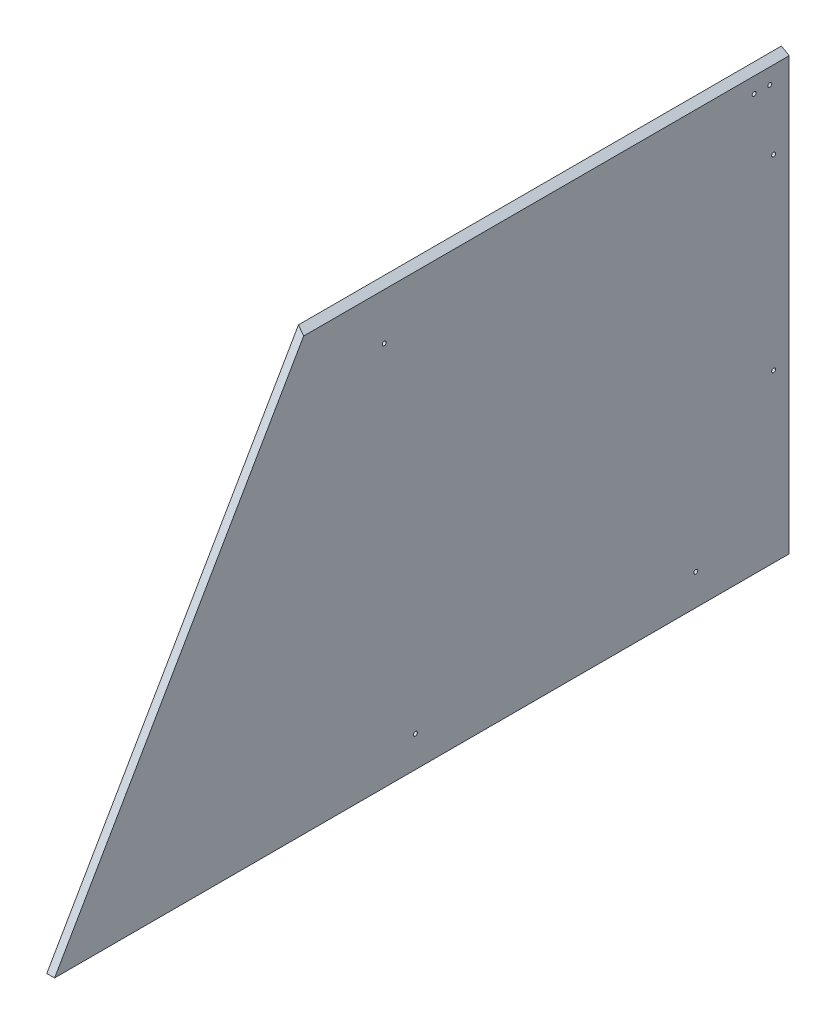
ISO-10303-21;
HEADER;
FILE_DESCRIPTION(('STEP AP214'),'2;1');
FILE_NAME('part.step','',(''),(''),'','','');
FILE_SCHEMA(('AUTOMOTIVE_DESIGN { 1 0 10303 214 1 1 1 1 }'));
ENDSEC;
DATA;
#1=APPLICATION_CONTEXT('core data for automotive mechanical design processes');
#2=APPLICATION_PROTOCOL_DEFINITION('international standard','automotive_design',2000,#1);
#3=PRODUCT_CONTEXT('',#1,'mechanical');
#4=PRODUCT('Part','Part','',(#3));
#5=PRODUCT_RELATED_PRODUCT_CATEGORY('part','',(#4));
#6=PRODUCT_DEFINITION_FORMATION('','',#4);
#7=PRODUCT_DEFINITION_CONTEXT('part definition',#1,'design');
#8=PRODUCT_DEFINITION('design','',#6,#7);
#9=PRODUCT_DEFINITION_SHAPE('','',#8);
#10=(LENGTH_UNIT() NAMED_UNIT(*) SI_UNIT(.MILLI.,.METRE.));
#11=(NAMED_UNIT(*) PLANE_ANGLE_UNIT() SI_UNIT($,.RADIAN.));
#12=(NAMED_UNIT(*) SI_UNIT($,.STERADIAN.) SOLID_ANGLE_UNIT());
#13=UNCERTAINTY_MEASURE_WITH_UNIT(LENGTH_MEASURE(1.E-05),#10,'distance_accuracy_value','');
#14=(GEOMETRIC_REPRESENTATION_CONTEXT(3) GLOBAL_UNCERTAINTY_ASSIGNED_CONTEXT((#13)) GLOBAL_UNIT_ASSIGNED_CONTEXT((#10,
#11,#12)) REPRESENTATION_CONTEXT('',''));
#15=CARTESIAN_POINT('',(0.,0.,0.));
#16=DIRECTION('',(0.,0.,1.));
#17=DIRECTION('',(1.,0.,0.));
#18=AXIS2_PLACEMENT_3D('',#15,#16,#17);
#19=CARTESIAN_POINT('',(6.35,105.408802096826,-559.540640379776));
#20=DIRECTION('',(0.,0.,1.));
#21=DIRECTION('',(0.,-1.,0.));
#22=AXIS2_PLACEMENT_3D('',#19,#20,#21);
#23=PLANE('',#22);
#24=DIRECTION('',(0.,1.,0.));
#25=VECTOR('',#24,1.);
#26=CARTESIAN_POINT('',(0.,105.408802096826,-559.540640379776));
#27=LINE('',#26,#25);
#28=CARTESIAN_POINT('',(0.,-250.191197903174,-559.540640379775));
#29=VERTEX_POINT('',#28);
#30=CARTESIAN_POINT('',(0.,105.232825734777,-559.540640379776));
#31=VERTEX_POINT('',#30);
#32=EDGE_CURVE('E110',#29,#31,#27,.T.);
#33=ORIENTED_EDGE('',*,*,#32,.T.);
#34=DIRECTION('',(0.866025403784436,-0.500000000000005,0.));
#35=VECTOR('',#34,1.);
#36=CARTESIAN_POINT('',(6.35000000000015,101.566651525422,-559.540640379776));
#37=LINE('',#36,#35);
#38=CARTESIAN_POINT('',(6.35,101.566651525422,-559.540640379776));
#39=VERTEX_POINT('',#38);
#40=EDGE_CURVE('E11',#31,#39,#37,.T.);
#41=ORIENTED_EDGE('',*,*,#40,.T.);
#42=DIRECTION('',(0.,1.,0.));
#43=VECTOR('',#42,1.);
#44=CARTESIAN_POINT('',(6.35,105.408802096826,-559.540640379776));
#45=LINE('',#44,#43);
#46=CARTESIAN_POINT('',(6.35,-250.191197903174,-559.540640379775));
#47=VERTEX_POINT('',#46);
#48=EDGE_CURVE('E93',#47,#39,#45,.T.);
#49=ORIENTED_EDGE('',*,*,#48,.F.);
#50=DIRECTION('',(-1.,0.,0.));
#51=VECTOR('',#50,1.);
#52=CARTESIAN_POINT('',(6.35,-250.191197903174,-559.540640379775));
#53=LINE('',#52,#51);
#54=EDGE_CURVE('E101',#47,#29,#53,.T.);
#55=ORIENTED_EDGE('',*,*,#54,.T.);
#56=EDGE_LOOP('',(#33,#41,#49,#55));
#57=FACE_BOUND('',#56,.T.);
#58=ADVANCED_FACE('F43',(#57),#23,.F.);
#59=CARTESIAN_POINT('',(6.35,-250.191197903174,39.465115344054));
#60=DIRECTION('',(0.,-0.499999999999998,-0.86602540378444));
#61=DIRECTION('',(0.,0.86602540378444,-0.499999999999998));
#62=AXIS2_PLACEMENT_3D('',#59,#60,#61);
#63=PLANE('',#62);
#64=DIRECTION('',(0.,-0.86602540378444,0.499999999999998));
#65=VECTOR('',#64,1.);
#66=CARTESIAN_POINT('',(6.35,-250.191197903174,39.465115344054));
#67=LINE('',#66,#65);
#68=CARTESIAN_POINT('',(6.35000000000004,101.566651525422,-163.622373713109));
#69=VERTEX_POINT('',#68);
#70=CARTESIAN_POINT('',(6.35,-250.191197903174,39.465115344054));
#71=VERTEX_POINT('',#70);
#72=EDGE_CURVE('E84',#69,#71,#67,.T.);
#73=ORIENTED_EDGE('',*,*,#72,.F.);
#74=DIRECTION('',(-0.832050294337841,0.480384461415266,-0.277350098112616));
#75=VECTOR('',#74,1.);
#76=CARTESIAN_POINT('',(44.1090093184098,79.7664773311047,-151.036037273639));
#77=LINE('',#76,#75);
#78=CARTESIAN_POINT('',(0.,105.232825734777,-165.739040379776));
#79=VERTEX_POINT('',#78);
#80=EDGE_CURVE('E67',#69,#79,#77,.T.);
#81=ORIENTED_EDGE('',*,*,#80,.T.);
#82=DIRECTION('',(0.,-0.86602540378444,0.499999999999998));
#83=VECTOR('',#82,1.);
#84=CARTESIAN_POINT('',(0.,-250.191197903174,39.465115344054));
#85=LINE('',#84,#83);
#86=CARTESIAN_POINT('',(0.,-250.191197903174,39.465115344054));
#87=VERTEX_POINT('',#86);
#88=EDGE_CURVE('E98',#79,#87,#85,.T.);
#89=ORIENTED_EDGE('',*,*,#88,.T.);
#90=DIRECTION('',(-1.,0.,0.));
#91=VECTOR('',#90,1.);
#92=CARTESIAN_POINT('',(6.35,-250.191197903174,39.465115344054));
#93=LINE('',#92,#91);
#94=EDGE_CURVE('E96',#71,#87,#93,.T.);
#95=ORIENTED_EDGE('',*,*,#94,.F.);
#96=EDGE_LOOP('',(#73,#81,#89,#95));
#97=FACE_BOUND('',#96,.T.);
#98=ADVANCED_FACE('F97',(#97),#63,.F.);
#99=CARTESIAN_POINT('',(6.35,-250.191197903174,39.465115344054));
#100=DIRECTION('',(0.,1.,0.));
#101=DIRECTION('',(0.,0.,1.));
#102=AXIS2_PLACEMENT_3D('',#99,#100,#101);
#103=PLANE('',#102);
#104=DIRECTION('',(0.,0.,-1.));
#105=VECTOR('',#104,1.);
#106=CARTESIAN_POINT('',(0.,-250.191197903174,39.465115344054));
#107=LINE('',#106,#105);
#108=EDGE_CURVE('E116',#87,#29,#107,.T.);
#109=ORIENTED_EDGE('',*,*,#108,.T.);
#110=ORIENTED_EDGE('',*,*,#54,.F.);
#111=DIRECTION('',(0.,0.,-1.));
#112=VECTOR('',#111,1.);
#113=CARTESIAN_POINT('',(6.35,-250.191197903174,39.465115344054));
#114=LINE('',#113,#112);
#115=EDGE_CURVE('E89',#71,#47,#114,.T.);
#116=ORIENTED_EDGE('',*,*,#115,.F.);
#117=ORIENTED_EDGE('',*,*,#94,.T.);
#118=EDGE_LOOP('',(#109,#110,#116,#117));
#119=FACE_BOUND('',#118,.T.);
#120=ADVANCED_FACE('F103',(#119),#103,.F.);
#121=CARTESIAN_POINT('',(6.35,0.,0.));
#122=DIRECTION('',(1.,0.,0.));
#123=DIRECTION('',(0.,0.,-1.));
#124=AXIS2_PLACEMENT_3D('',#121,#122,#123);
#125=PLANE('',#124);
#126=CARTESIAN_POINT('',(6.34999999999999,-224.791197903174,-483.340640379775));
#127=DIRECTION('',(-1.,0.,0.));
#128=DIRECTION('',(0.,0.,1.));
#129=AXIS2_PLACEMENT_3D('',#126,#127,#128);
#130=CIRCLE('',#129,1.63194999999999);
#131=CARTESIAN_POINT('',(6.34999999999999,-224.791197903174,-481.708690379775));
#132=VERTEX_POINT('',#131);
#133=EDGE_CURVE('E175',#132,#132,#130,.T.);
#134=ORIENTED_EDGE('',*,*,#133,.T.);
#135=EDGE_LOOP('',(#134));
#136=FACE_BOUND('',#135,.T.);
#137=CARTESIAN_POINT('',(6.34999999999999,-224.791197903174,-254.740640379775));
#138=DIRECTION('',(-1.,0.,0.));
#139=DIRECTION('',(0.,0.,1.));
#140=AXIS2_PLACEMENT_3D('',#137,#138,#139);
#141=CIRCLE('',#140,1.63194999999999);
#142=CARTESIAN_POINT('',(6.34999999999999,-224.791197903174,-253.108690379775));
#143=VERTEX_POINT('',#142);
#144=EDGE_CURVE('E166',#143,#143,#141,.T.);
#145=ORIENTED_EDGE('',*,*,#144,.T.);
#146=EDGE_LOOP('',(#145));
#147=FACE_BOUND('',#146,.T.);
#148=CARTESIAN_POINT('',(6.34999999999999,88.8666515254223,-543.665640379775));
#149=DIRECTION('',(-1.,0.,0.));
#150=DIRECTION('',(0.,0.,1.));
#151=AXIS2_PLACEMENT_3D('',#148,#149,#150);
#152=CIRCLE('',#151,1.63194999999999);
#153=CARTESIAN_POINT('',(6.34999999999999,88.8666515254223,-542.033690379775));
#154=VERTEX_POINT('',#153);
#155=EDGE_CURVE('E157',#154,#154,#152,.T.);
#156=ORIENTED_EDGE('',*,*,#155,.T.);
#157=EDGE_LOOP('',(#156));
#158=FACE_BOUND('',#157,.T.);
#159=CARTESIAN_POINT('',(6.34999999999999,88.8666515254223,-530.965640379775));
#160=DIRECTION('',(-1.,0.,0.));
#161=DIRECTION('',(0.,0.,1.));
#162=AXIS2_PLACEMENT_3D('',#159,#160,#161);
#163=CIRCLE('',#162,1.63194999999999);
#164=CARTESIAN_POINT('',(6.34999999999999,88.8666515254223,-529.333690379775));
#165=VERTEX_POINT('',#164);
#166=EDGE_CURVE('E148',#165,#165,#163,.T.);
#167=ORIENTED_EDGE('',*,*,#166,.T.);
#168=EDGE_LOOP('',(#167));
#169=FACE_BOUND('',#168,.T.);
#170=CARTESIAN_POINT('',(6.35,38.0988020968257,-546.840640379776));
#171=DIRECTION('',(-1.,0.,0.));
#172=DIRECTION('',(0.,0.,1.));
#173=AXIS2_PLACEMENT_3D('',#170,#171,#172);
#174=CIRCLE('',#173,1.63194999999999);
#175=CARTESIAN_POINT('',(6.35,38.0988020968257,-545.208690379776));
#176=VERTEX_POINT('',#175);
#177=EDGE_CURVE('E139',#176,#176,#174,.T.);
#178=ORIENTED_EDGE('',*,*,#177,.T.);
#179=EDGE_LOOP('',(#178));
#180=FACE_BOUND('',#179,.T.);
#181=CARTESIAN_POINT('',(6.35,63.4988020968257,-229.340640379776));
#182=DIRECTION('',(-1.,0.,0.));
#183=DIRECTION('',(0.,0.,1.));
#184=AXIS2_PLACEMENT_3D('',#181,#182,#183);
#185=CIRCLE('',#184,1.63194999999999);
#186=CARTESIAN_POINT('',(6.35,63.4988020968257,-227.708690379776));
#187=VERTEX_POINT('',#186);
#188=EDGE_CURVE('E130',#187,#187,#185,.T.);
#189=ORIENTED_EDGE('',*,*,#188,.T.);
#190=EDGE_LOOP('',(#189));
#191=FACE_BOUND('',#190,.T.);
#192=CARTESIAN_POINT('',(6.35,-114.301197903174,-546.840640379776));
#193=DIRECTION('',(-1.,0.,0.));
#194=DIRECTION('',(0.,0.,1.));
#195=AXIS2_PLACEMENT_3D('',#192,#193,#194);
#196=CIRCLE('',#195,1.63194999999999);
#197=CARTESIAN_POINT('',(6.35,-114.301197903174,-545.208690379775));
#198=VERTEX_POINT('',#197);
#199=EDGE_CURVE('E113',#198,#198,#196,.T.);
#200=ORIENTED_EDGE('',*,*,#199,.T.);
#201=EDGE_LOOP('',(#200));
#202=FACE_BOUND('',#201,.T.);
#203=ORIENTED_EDGE('',*,*,#48,.T.);
#204=DIRECTION('',(0.,0.,1.));
#205=VECTOR('',#204,1.);
#206=CARTESIAN_POINT('',(6.35,101.566651525422,-165.840640379776));
#207=LINE('',#206,#205);
#208=EDGE_CURVE('E92',#39,#69,#207,.T.);
#209=ORIENTED_EDGE('',*,*,#208,.T.);
#210=ORIENTED_EDGE('',*,*,#72,.T.);
#211=ORIENTED_EDGE('',*,*,#115,.T.);
#212=EDGE_LOOP('',(#203,#209,#210,#211));
#213=FACE_BOUND('',#212,.T.);
#214=ADVANCED_FACE('F87',(#136,#147,#158,#169,#180,#191,#202,#213),#125,.T.);
#215=CARTESIAN_POINT('',(0.,0.,0.));
#216=DIRECTION('',(1.,0.,0.));
#217=DIRECTION('',(0.,0.,-1.));
#218=AXIS2_PLACEMENT_3D('',#215,#216,#217);
#219=PLANE('',#218);
#220=CARTESIAN_POINT('',(0.,-224.791197903174,-483.340640379775));
#221=DIRECTION('',(-1.,0.,0.));
#222=DIRECTION('',(0.,0.,1.));
#223=AXIS2_PLACEMENT_3D('',#220,#221,#222);
#224=CIRCLE('',#223,2.85749999999998);
#225=CARTESIAN_POINT('',(0.,-224.791197903174,-480.483140379775));
#226=VERTEX_POINT('',#225);
#227=EDGE_CURVE('E181',#226,#226,#224,.T.);
#228=ORIENTED_EDGE('',*,*,#227,.F.);
#229=EDGE_LOOP('',(#228));
#230=FACE_BOUND('',#229,.T.);
#231=CARTESIAN_POINT('',(0.,-224.791197903174,-254.740640379775));
#232=DIRECTION('',(-1.,0.,0.));
#233=DIRECTION('',(0.,0.,1.));
#234=AXIS2_PLACEMENT_3D('',#231,#232,#233);
#235=CIRCLE('',#234,2.85749999999998);
#236=CARTESIAN_POINT('',(0.,-224.791197903174,-251.883140379775));
#237=VERTEX_POINT('',#236);
#238=EDGE_CURVE('E172',#237,#237,#235,.T.);
#239=ORIENTED_EDGE('',*,*,#238,.F.);
#240=EDGE_LOOP('',(#239));
#241=FACE_BOUND('',#240,.T.);
#242=CARTESIAN_POINT('',(0.,88.8666515254223,-543.665640379775));
#243=DIRECTION('',(-1.,0.,0.));
#244=DIRECTION('',(0.,0.,1.));
#245=AXIS2_PLACEMENT_3D('',#242,#243,#244);
#246=CIRCLE('',#245,2.8575);
#247=CARTESIAN_POINT('',(0.,88.8666515254223,-540.808140379775));
#248=VERTEX_POINT('',#247);
#249=EDGE_CURVE('E163',#248,#248,#246,.T.);
#250=ORIENTED_EDGE('',*,*,#249,.F.);
#251=EDGE_LOOP('',(#250));
#252=FACE_BOUND('',#251,.T.);
#253=CARTESIAN_POINT('',(0.,88.8666515254223,-530.965640379775));
#254=DIRECTION('',(-1.,0.,0.));
#255=DIRECTION('',(0.,0.,1.));
#256=AXIS2_PLACEMENT_3D('',#253,#254,#255);
#257=CIRCLE('',#256,2.8575);
#258=CARTESIAN_POINT('',(0.,88.8666515254223,-528.108140379775));
#259=VERTEX_POINT('',#258);
#260=EDGE_CURVE('E154',#259,#259,#257,.T.);
#261=ORIENTED_EDGE('',*,*,#260,.F.);
#262=EDGE_LOOP('',(#261));
#263=FACE_BOUND('',#262,.T.);
#264=CARTESIAN_POINT('',(0.,38.0988020968257,-546.840640379776));
#265=DIRECTION('',(-1.,0.,0.));
#266=DIRECTION('',(0.,0.,1.));
#267=AXIS2_PLACEMENT_3D('',#264,#265,#266);
#268=CIRCLE('',#267,2.8575);
#269=CARTESIAN_POINT('',(0.,38.0988020968257,-543.983140379776));
#270=VERTEX_POINT('',#269);
#271=EDGE_CURVE('E145',#270,#270,#268,.T.);
#272=ORIENTED_EDGE('',*,*,#271,.F.);
#273=EDGE_LOOP('',(#272));
#274=FACE_BOUND('',#273,.T.);
#275=CARTESIAN_POINT('',(0.,63.4988020968257,-229.340640379776));
#276=DIRECTION('',(-1.,0.,0.));
#277=DIRECTION('',(0.,0.,1.));
#278=AXIS2_PLACEMENT_3D('',#275,#276,#277);
#279=CIRCLE('',#278,2.8575);
#280=CARTESIAN_POINT('',(0.,63.4988020968257,-226.483140379776));
#281=VERTEX_POINT('',#280);
#282=EDGE_CURVE('E136',#281,#281,#279,.T.);
#283=ORIENTED_EDGE('',*,*,#282,.F.);
#284=EDGE_LOOP('',(#283));
#285=FACE_BOUND('',#284,.T.);
#286=CARTESIAN_POINT('',(0.,-114.301197903174,-546.840640379776));
#287=DIRECTION('',(-1.,0.,0.));
#288=DIRECTION('',(0.,0.,1.));
#289=AXIS2_PLACEMENT_3D('',#286,#287,#288);
#290=CIRCLE('',#289,2.8575);
#291=CARTESIAN_POINT('',(0.,-114.301197903174,-543.983140379776));
#292=VERTEX_POINT('',#291);
#293=EDGE_CURVE('E127',#292,#292,#290,.T.);
#294=ORIENTED_EDGE('',*,*,#293,.F.);
#295=EDGE_LOOP('',(#294));
#296=FACE_BOUND('',#295,.T.);
#297=ORIENTED_EDGE('',*,*,#88,.F.);
#298=DIRECTION('',(0.,0.,-1.));
#299=VECTOR('',#298,1.);
#300=CARTESIAN_POINT('',(0.,105.232825734777,0.));
#301=LINE('',#300,#299);
#302=EDGE_CURVE('E52',#79,#31,#301,.T.);
#303=ORIENTED_EDGE('',*,*,#302,.T.);
#304=ORIENTED_EDGE('',*,*,#32,.F.);
#305=ORIENTED_EDGE('',*,*,#108,.F.);
#306=EDGE_LOOP('',(#297,#303,#304,#305));
#307=FACE_BOUND('',#306,.T.);
#308=ADVANCED_FACE('F187',(#230,#241,#252,#263,#274,#285,#296,#307),#219,.F.);
#309=CARTESIAN_POINT('',(6.35,101.566651525422,0.));
#310=DIRECTION('',(0.500000000000005,0.866025403784436,0.));
#311=DIRECTION('',(0.,0.,-1.));
#312=AXIS2_PLACEMENT_3D('',#309,#310,#311);
#313=PLANE('',#312);
#314=ORIENTED_EDGE('',*,*,#40,.F.);
#315=ORIENTED_EDGE('',*,*,#302,.F.);
#316=ORIENTED_EDGE('',*,*,#80,.F.);
#317=ORIENTED_EDGE('',*,*,#208,.F.);
#318=EDGE_LOOP('',(#314,#315,#316,#317));
#319=FACE_BOUND('',#318,.T.);
#320=ADVANCED_FACE('F45',(#319),#313,.T.);
#321=CARTESIAN_POINT('',(0.,-114.301197903174,-546.840640379776));
#322=DIRECTION('',(-1.,0.,0.));
#323=DIRECTION('',(0.,0.,1.));
#324=AXIS2_PLACEMENT_3D('',#321,#322,#323);
#325=CYLINDRICAL_SURFACE('',#324,1.63194999999999);
#326=ORIENTED_EDGE('',*,*,#199,.F.);
#327=EDGE_LOOP('',(#326));
#328=FACE_BOUND('',#327,.T.);
#329=CARTESIAN_POINT('',(1.40983400146971,-114.301197903174,-546.840640379776));
#330=DIRECTION('',(-1.,0.,0.));
#331=DIRECTION('',(0.,0.,1.));
#332=AXIS2_PLACEMENT_3D('',#329,#330,#331);
#333=CIRCLE('',#332,1.63194999999999);
#334=CARTESIAN_POINT('',(1.40983400146971,-114.301197903174,-545.208690379775));
#335=VERTEX_POINT('',#334);
#336=EDGE_CURVE('E124',#335,#335,#333,.T.);
#337=ORIENTED_EDGE('',*,*,#336,.T.);
#338=EDGE_LOOP('',(#337));
#339=FACE_BOUND('',#338,.T.);
#340=ADVANCED_FACE('F216',(#328,#339),#325,.F.);
#341=CARTESIAN_POINT('',(0.,-114.301197903174,-546.840640379776));
#342=DIRECTION('',(-1.,0.,0.));
#343=DIRECTION('',(0.,0.,1.));
#344=AXIS2_PLACEMENT_3D('',#341,#342,#343);
#345=CONICAL_SURFACE('',#344,2.8575,0.715584993317676);
#346=ORIENTED_EDGE('',*,*,#336,.F.);
#347=EDGE_LOOP('',(#346));
#348=FACE_BOUND('',#347,.T.);
#349=ORIENTED_EDGE('',*,*,#293,.T.);
#350=EDGE_LOOP('',(#349));
#351=FACE_BOUND('',#350,.T.);
#352=ADVANCED_FACE('F219',(#348,#351),#345,.F.);
#353=CARTESIAN_POINT('',(0.,63.4988020968257,-229.340640379776));
#354=DIRECTION('',(-1.,0.,0.));
#355=DIRECTION('',(0.,0.,1.));
#356=AXIS2_PLACEMENT_3D('',#353,#354,#355);
#357=CYLINDRICAL_SURFACE('',#356,1.63194999999999);
#358=ORIENTED_EDGE('',*,*,#188,.F.);
#359=EDGE_LOOP('',(#358));
#360=FACE_BOUND('',#359,.T.);
#361=CARTESIAN_POINT('',(1.40983400146971,63.4988020968257,-229.340640379776));
#362=DIRECTION('',(-1.,0.,0.));
#363=DIRECTION('',(0.,0.,1.));
#364=AXIS2_PLACEMENT_3D('',#361,#362,#363);
#365=CIRCLE('',#364,1.63194999999999);
#366=CARTESIAN_POINT('',(1.40983400146971,63.4988020968257,-227.708690379776));
#367=VERTEX_POINT('',#366);
#368=EDGE_CURVE('E133',#367,#367,#365,.T.);
#369=ORIENTED_EDGE('',*,*,#368,.T.);
#370=EDGE_LOOP('',(#369));
#371=FACE_BOUND('',#370,.T.);
#372=ADVANCED_FACE('F223',(#360,#371),#357,.F.);
#373=CARTESIAN_POINT('',(0.,63.4988020968257,-229.340640379776));
#374=DIRECTION('',(-1.,0.,0.));
#375=DIRECTION('',(0.,0.,1.));
#376=AXIS2_PLACEMENT_3D('',#373,#374,#375);
#377=CONICAL_SURFACE('',#376,2.8575,0.715584993317676);
#378=ORIENTED_EDGE('',*,*,#368,.F.);
#379=EDGE_LOOP('',(#378));
#380=FACE_BOUND('',#379,.T.);
#381=ORIENTED_EDGE('',*,*,#282,.T.);
#382=EDGE_LOOP('',(#381));
#383=FACE_BOUND('',#382,.T.);
#384=ADVANCED_FACE('F227',(#380,#383),#377,.F.);
#385=CARTESIAN_POINT('',(0.,38.0988020968257,-546.840640379776));
#386=DIRECTION('',(-1.,0.,0.));
#387=DIRECTION('',(0.,0.,1.));
#388=AXIS2_PLACEMENT_3D('',#385,#386,#387);
#389=CYLINDRICAL_SURFACE('',#388,1.63195);
#390=ORIENTED_EDGE('',*,*,#177,.F.);
#391=EDGE_LOOP('',(#390));
#392=FACE_BOUND('',#391,.T.);
#393=CARTESIAN_POINT('',(1.40983400146971,38.0988020968257,-546.840640379776));
#394=DIRECTION('',(-1.,0.,0.));
#395=DIRECTION('',(0.,0.,1.));
#396=AXIS2_PLACEMENT_3D('',#393,#394,#395);
#397=CIRCLE('',#396,1.63195);
#398=CARTESIAN_POINT('',(1.40983400146971,38.0988020968257,-545.208690379776));
#399=VERTEX_POINT('',#398);
#400=EDGE_CURVE('E142',#399,#399,#397,.T.);
#401=ORIENTED_EDGE('',*,*,#400,.T.);
#402=EDGE_LOOP('',(#401));
#403=FACE_BOUND('',#402,.T.);
#404=ADVANCED_FACE('F231',(#392,#403),#389,.F.);
#405=CARTESIAN_POINT('',(0.,38.0988020968257,-546.840640379776));
#406=DIRECTION('',(-1.,0.,0.));
#407=DIRECTION('',(0.,0.,1.));
#408=AXIS2_PLACEMENT_3D('',#405,#406,#407);
#409=CONICAL_SURFACE('',#408,2.8575,0.715584993317674);
#410=ORIENTED_EDGE('',*,*,#400,.F.);
#411=EDGE_LOOP('',(#410));
#412=FACE_BOUND('',#411,.T.);
#413=ORIENTED_EDGE('',*,*,#271,.T.);
#414=EDGE_LOOP('',(#413));
#415=FACE_BOUND('',#414,.T.);
#416=ADVANCED_FACE('F235',(#412,#415),#409,.F.);
#417=CARTESIAN_POINT('',(0.,88.8666515254223,-530.965640379775));
#418=DIRECTION('',(-1.,0.,0.));
#419=DIRECTION('',(0.,0.,1.));
#420=AXIS2_PLACEMENT_3D('',#417,#418,#419);
#421=CYLINDRICAL_SURFACE('',#420,1.63194999999999);
#422=ORIENTED_EDGE('',*,*,#166,.F.);
#423=EDGE_LOOP('',(#422));
#424=FACE_BOUND('',#423,.T.);
#425=CARTESIAN_POINT('',(1.40983400146971,88.8666515254223,-530.965640379775));
#426=DIRECTION('',(-1.,0.,0.));
#427=DIRECTION('',(0.,0.,1.));
#428=AXIS2_PLACEMENT_3D('',#425,#426,#427);
#429=CIRCLE('',#428,1.63194999999999);
#430=CARTESIAN_POINT('',(1.40983400146971,88.8666515254223,-529.333690379775));
#431=VERTEX_POINT('',#430);
#432=EDGE_CURVE('E151',#431,#431,#429,.T.);
#433=ORIENTED_EDGE('',*,*,#432,.T.);
#434=EDGE_LOOP('',(#433));
#435=FACE_BOUND('',#434,.T.);
#436=ADVANCED_FACE('F239',(#424,#435),#421,.F.);
#437=CARTESIAN_POINT('',(0.,88.8666515254223,-530.965640379775));
#438=DIRECTION('',(-1.,0.,0.));
#439=DIRECTION('',(0.,0.,1.));
#440=AXIS2_PLACEMENT_3D('',#437,#438,#439);
#441=CONICAL_SURFACE('',#440,2.8575,0.715584993317677);
#442=ORIENTED_EDGE('',*,*,#432,.F.);
#443=EDGE_LOOP('',(#442));
#444=FACE_BOUND('',#443,.T.);
#445=ORIENTED_EDGE('',*,*,#260,.T.);
#446=EDGE_LOOP('',(#445));
#447=FACE_BOUND('',#446,.T.);
#448=ADVANCED_FACE('F243',(#444,#447),#441,.F.);
#449=CARTESIAN_POINT('',(0.,88.8666515254223,-543.665640379775));
#450=DIRECTION('',(-1.,0.,0.));
#451=DIRECTION('',(0.,0.,1.));
#452=AXIS2_PLACEMENT_3D('',#449,#450,#451);
#453=CYLINDRICAL_SURFACE('',#452,1.63194999999999);
#454=ORIENTED_EDGE('',*,*,#155,.F.);
#455=EDGE_LOOP('',(#454));
#456=FACE_BOUND('',#455,.T.);
#457=CARTESIAN_POINT('',(1.40983400146971,88.8666515254223,-543.665640379775));
#458=DIRECTION('',(-1.,0.,0.));
#459=DIRECTION('',(0.,0.,1.));
#460=AXIS2_PLACEMENT_3D('',#457,#458,#459);
#461=CIRCLE('',#460,1.63194999999999);
#462=CARTESIAN_POINT('',(1.40983400146971,88.8666515254223,-542.033690379775));
#463=VERTEX_POINT('',#462);
#464=EDGE_CURVE('E160',#463,#463,#461,.T.);
#465=ORIENTED_EDGE('',*,*,#464,.T.);
#466=EDGE_LOOP('',(#465));
#467=FACE_BOUND('',#466,.T.);
#468=ADVANCED_FACE('F247',(#456,#467),#453,.F.);
#469=CARTESIAN_POINT('',(0.,88.8666515254223,-543.665640379775));
#470=DIRECTION('',(-1.,0.,0.));
#471=DIRECTION('',(0.,0.,1.));
#472=AXIS2_PLACEMENT_3D('',#469,#470,#471);
#473=CONICAL_SURFACE('',#472,2.8575,0.715584993317677);
#474=ORIENTED_EDGE('',*,*,#464,.F.);
#475=EDGE_LOOP('',(#474));
#476=FACE_BOUND('',#475,.T.);
#477=ORIENTED_EDGE('',*,*,#249,.T.);
#478=EDGE_LOOP('',(#477));
#479=FACE_BOUND('',#478,.T.);
#480=ADVANCED_FACE('F251',(#476,#479),#473,.F.);
#481=CARTESIAN_POINT('',(0.,-224.791197903174,-254.740640379775));
#482=DIRECTION('',(-1.,0.,0.));
#483=DIRECTION('',(0.,0.,1.));
#484=AXIS2_PLACEMENT_3D('',#481,#482,#483);
#485=CYLINDRICAL_SURFACE('',#484,1.63194999999999);
#486=ORIENTED_EDGE('',*,*,#144,.F.);
#487=EDGE_LOOP('',(#486));
#488=FACE_BOUND('',#487,.T.);
#489=CARTESIAN_POINT('',(1.40983400146974,-224.791197903174,-254.740640379775));
#490=DIRECTION('',(-1.,0.,0.));
#491=DIRECTION('',(0.,0.,1.));
#492=AXIS2_PLACEMENT_3D('',#489,#490,#491);
#493=CIRCLE('',#492,1.63194999999999);
#494=CARTESIAN_POINT('',(1.40983400146974,-224.791197903174,-253.108690379775));
#495=VERTEX_POINT('',#494);
#496=EDGE_CURVE('E169',#495,#495,#493,.T.);
#497=ORIENTED_EDGE('',*,*,#496,.T.);
#498=EDGE_LOOP('',(#497));
#499=FACE_BOUND('',#498,.T.);
#500=ADVANCED_FACE('F255',(#488,#499),#485,.F.);
#501=CARTESIAN_POINT('',(0.,-224.791197903174,-254.740640379775));
#502=DIRECTION('',(-1.,0.,0.));
#503=DIRECTION('',(0.,0.,1.));
#504=AXIS2_PLACEMENT_3D('',#501,#502,#503);
#505=CONICAL_SURFACE('',#504,2.85749999999998,0.71558499331766);
#506=ORIENTED_EDGE('',*,*,#496,.F.);
#507=EDGE_LOOP('',(#506));
#508=FACE_BOUND('',#507,.T.);
#509=ORIENTED_EDGE('',*,*,#238,.T.);
#510=EDGE_LOOP('',(#509));
#511=FACE_BOUND('',#510,.T.);
#512=ADVANCED_FACE('F259',(#508,#511),#505,.F.);
#513=CARTESIAN_POINT('',(0.,-224.791197903174,-483.340640379775));
#514=DIRECTION('',(-1.,0.,0.));
#515=DIRECTION('',(0.,0.,1.));
#516=AXIS2_PLACEMENT_3D('',#513,#514,#515);
#517=CYLINDRICAL_SURFACE('',#516,1.63194999999999);
#518=ORIENTED_EDGE('',*,*,#133,.F.);
#519=EDGE_LOOP('',(#518));
#520=FACE_BOUND('',#519,.T.);
#521=CARTESIAN_POINT('',(1.40983400146974,-224.791197903174,-483.340640379775));
#522=DIRECTION('',(-1.,0.,0.));
#523=DIRECTION('',(0.,0.,1.));
#524=AXIS2_PLACEMENT_3D('',#521,#522,#523);
#525=CIRCLE('',#524,1.63194999999999);
#526=CARTESIAN_POINT('',(1.40983400146974,-224.791197903174,-481.708690379775));
#527=VERTEX_POINT('',#526);
#528=EDGE_CURVE('E178',#527,#527,#525,.T.);
#529=ORIENTED_EDGE('',*,*,#528,.T.);
#530=EDGE_LOOP('',(#529));
#531=FACE_BOUND('',#530,.T.);
#532=ADVANCED_FACE('F263',(#520,#531),#517,.F.);
#533=CARTESIAN_POINT('',(0.,-224.791197903174,-483.340640379775));
#534=DIRECTION('',(-1.,0.,0.));
#535=DIRECTION('',(0.,0.,1.));
#536=AXIS2_PLACEMENT_3D('',#533,#534,#535);
#537=CONICAL_SURFACE('',#536,2.85749999999998,0.71558499331766);
#538=ORIENTED_EDGE('',*,*,#528,.F.);
#539=EDGE_LOOP('',(#538));
#540=FACE_BOUND('',#539,.T.);
#541=ORIENTED_EDGE('',*,*,#227,.T.);
#542=EDGE_LOOP('',(#541));
#543=FACE_BOUND('',#542,.T.);
#544=ADVANCED_FACE('F185',(#540,#543),#537,.F.);
#545=CLOSED_SHELL('',(#58,#98,#120,#214,#308,#320,#340,#352,#372,#384,#404,#416,#436,#448,#468,
#480,#500,#512,#532,#544));
#546=MANIFOLD_SOLID_BREP('B2',#545);
#547=ADVANCED_BREP_SHAPE_REPRESENTATION('',(#18,#546),#14);
#548=SHAPE_DEFINITION_REPRESENTATION(#9,#547);
ENDSEC;
END-ISO-10303-21;
